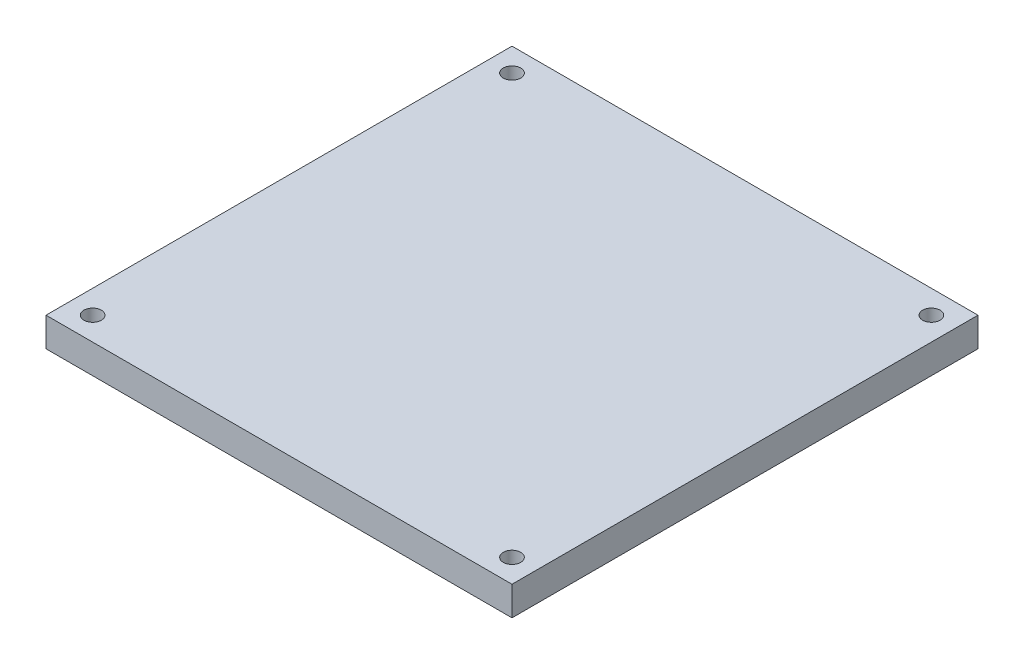
ISO-10303-21;
HEADER;
FILE_DESCRIPTION(('STEP AP214'),'2;1');
FILE_NAME('part.step','',(''),(''),'','','');
FILE_SCHEMA(('AUTOMOTIVE_DESIGN { 1 0 10303 214 1 1 1 1 }'));
ENDSEC;
DATA;
#1=APPLICATION_CONTEXT('core data for automotive mechanical design processes');
#2=APPLICATION_PROTOCOL_DEFINITION('international standard','automotive_design',2000,#1);
#3=PRODUCT_CONTEXT('',#1,'mechanical');
#4=PRODUCT('Part','Part','',(#3));
#5=PRODUCT_RELATED_PRODUCT_CATEGORY('part','',(#4));
#6=PRODUCT_DEFINITION_FORMATION('','',#4);
#7=PRODUCT_DEFINITION_CONTEXT('part definition',#1,'design');
#8=PRODUCT_DEFINITION('design','',#6,#7);
#9=PRODUCT_DEFINITION_SHAPE('','',#8);
#10=(LENGTH_UNIT() NAMED_UNIT(*) SI_UNIT(.MILLI.,.METRE.));
#11=(NAMED_UNIT(*) PLANE_ANGLE_UNIT() SI_UNIT($,.RADIAN.));
#12=(NAMED_UNIT(*) SI_UNIT($,.STERADIAN.) SOLID_ANGLE_UNIT());
#13=UNCERTAINTY_MEASURE_WITH_UNIT(LENGTH_MEASURE(1.E-05),#10,'distance_accuracy_value','');
#14=(GEOMETRIC_REPRESENTATION_CONTEXT(3) GLOBAL_UNCERTAINTY_ASSIGNED_CONTEXT((#13)) GLOBAL_UNIT_ASSIGNED_CONTEXT((#10,
#11,#12)) REPRESENTATION_CONTEXT('',''));
#15=CARTESIAN_POINT('',(0.,0.,0.));
#16=DIRECTION('',(0.,0.,1.));
#17=DIRECTION('',(1.,0.,0.));
#18=AXIS2_PLACEMENT_3D('',#15,#16,#17);
#19=CARTESIAN_POINT('',(-40.,5.,40.));
#20=DIRECTION('',(0.,1.,0.));
#21=DIRECTION('',(0.,0.,1.));
#22=AXIS2_PLACEMENT_3D('',#19,#20,#21);
#23=PLANE('',#22);
#24=CARTESIAN_POINT('',(-36.,5.,36.));
#25=DIRECTION('',(0.,1.,0.));
#26=DIRECTION('',(0.,0.,-1.));
#27=AXIS2_PLACEMENT_3D('',#24,#25,#26);
#28=CIRCLE('',#27,1.5);
#29=CARTESIAN_POINT('',(-36.,5.,34.5));
#30=VERTEX_POINT('',#29);
#31=EDGE_CURVE('E142',#30,#30,#28,.T.);
#32=ORIENTED_EDGE('',*,*,#31,.F.);
#33=EDGE_LOOP('',(#32));
#34=FACE_BOUND('',#33,.T.);
#35=CARTESIAN_POINT('',(-36.,5.,-36.));
#36=DIRECTION('',(0.,1.,0.));
#37=DIRECTION('',(0.,0.,1.));
#38=AXIS2_PLACEMENT_3D('',#35,#36,#37);
#39=CIRCLE('',#38,1.5);
#40=CARTESIAN_POINT('',(-36.,5.,-34.5));
#41=VERTEX_POINT('',#40);
#42=EDGE_CURVE('E112',#41,#41,#39,.T.);
#43=ORIENTED_EDGE('',*,*,#42,.F.);
#44=EDGE_LOOP('',(#43));
#45=FACE_BOUND('',#44,.T.);
#46=DIRECTION('',(0.,0.,1.));
#47=VECTOR('',#46,1.);
#48=CARTESIAN_POINT('',(-40.,5.,-40.));
#49=LINE('',#48,#47);
#50=CARTESIAN_POINT('',(-40.,5.,-40.));
#51=VERTEX_POINT('',#50);
#52=CARTESIAN_POINT('',(-40.,5.,40.));
#53=VERTEX_POINT('',#52);
#54=EDGE_CURVE('E92',#51,#53,#49,.T.);
#55=ORIENTED_EDGE('',*,*,#54,.T.);
#56=DIRECTION('',(1.,0.,0.));
#57=VECTOR('',#56,1.);
#58=CARTESIAN_POINT('',(-40.,5.,40.));
#59=LINE('',#58,#57);
#60=CARTESIAN_POINT('',(40.,5.,40.));
#61=VERTEX_POINT('',#60);
#62=EDGE_CURVE('E87',#53,#61,#59,.T.);
#63=ORIENTED_EDGE('',*,*,#62,.T.);
#64=DIRECTION('',(0.,0.,-1.));
#65=VECTOR('',#64,1.);
#66=CARTESIAN_POINT('',(40.,5.,-40.));
#67=LINE('',#66,#65);
#68=CARTESIAN_POINT('',(40.,5.,-40.));
#69=VERTEX_POINT('',#68);
#70=EDGE_CURVE('E90',#61,#69,#67,.T.);
#71=ORIENTED_EDGE('',*,*,#70,.T.);
#72=DIRECTION('',(-1.,0.,0.));
#73=VECTOR('',#72,1.);
#74=CARTESIAN_POINT('',(-40.,5.,-40.));
#75=LINE('',#74,#73);
#76=EDGE_CURVE('E57',#69,#51,#75,.T.);
#77=ORIENTED_EDGE('',*,*,#76,.T.);
#78=EDGE_LOOP('',(#55,#63,#71,#77));
#79=FACE_BOUND('',#78,.T.);
#80=CARTESIAN_POINT('',(36.,5.,-36.));
#81=DIRECTION('',(0.,1.,0.));
#82=DIRECTION('',(0.,0.,-1.));
#83=AXIS2_PLACEMENT_3D('',#80,#81,#82);
#84=CIRCLE('',#83,1.5);
#85=CARTESIAN_POINT('',(36.,5.,-37.5));
#86=VERTEX_POINT('',#85);
#87=EDGE_CURVE('E134',#86,#86,#84,.T.);
#88=ORIENTED_EDGE('',*,*,#87,.F.);
#89=EDGE_LOOP('',(#88));
#90=FACE_BOUND('',#89,.T.);
#91=CARTESIAN_POINT('',(36.,5.,36.));
#92=DIRECTION('',(0.,1.,0.));
#93=DIRECTION('',(0.,0.,1.));
#94=AXIS2_PLACEMENT_3D('',#91,#92,#93);
#95=CIRCLE('',#94,1.5);
#96=CARTESIAN_POINT('',(36.,5.,37.5));
#97=VERTEX_POINT('',#96);
#98=EDGE_CURVE('E150',#97,#97,#95,.T.);
#99=ORIENTED_EDGE('',*,*,#98,.F.);
#100=EDGE_LOOP('',(#99));
#101=FACE_BOUND('',#100,.T.);
#102=ADVANCED_FACE('F39',(#34,#45,#79,#90,#101),#23,.T.);
#103=CARTESIAN_POINT('',(-40.,0.,40.));
#104=DIRECTION('',(0.,1.,0.));
#105=DIRECTION('',(0.,0.,1.));
#106=AXIS2_PLACEMENT_3D('',#103,#104,#105);
#107=PLANE('',#106);
#108=CARTESIAN_POINT('',(-36.,0.,36.));
#109=DIRECTION('',(0.,1.,0.));
#110=DIRECTION('',(0.,0.,-1.));
#111=AXIS2_PLACEMENT_3D('',#108,#109,#110);
#112=CIRCLE('',#111,1.5);
#113=CARTESIAN_POINT('',(-36.,0.,34.5));
#114=VERTEX_POINT('',#113);
#115=EDGE_CURVE('E146',#114,#114,#112,.T.);
#116=ORIENTED_EDGE('',*,*,#115,.T.);
#117=EDGE_LOOP('',(#116));
#118=FACE_BOUND('',#117,.T.);
#119=CARTESIAN_POINT('',(-36.,0.,-36.));
#120=DIRECTION('',(0.,1.,0.));
#121=DIRECTION('',(0.,0.,1.));
#122=AXIS2_PLACEMENT_3D('',#119,#120,#121);
#123=CIRCLE('',#122,1.5);
#124=CARTESIAN_POINT('',(-36.,0.,-34.5));
#125=VERTEX_POINT('',#124);
#126=EDGE_CURVE('E130',#125,#125,#123,.T.);
#127=ORIENTED_EDGE('',*,*,#126,.T.);
#128=EDGE_LOOP('',(#127));
#129=FACE_BOUND('',#128,.T.);
#130=DIRECTION('',(0.,0.,1.));
#131=VECTOR('',#130,1.);
#132=CARTESIAN_POINT('',(-40.,0.,-40.));
#133=LINE('',#132,#131);
#134=CARTESIAN_POINT('',(-40.,0.,-40.));
#135=VERTEX_POINT('',#134);
#136=CARTESIAN_POINT('',(-40.,0.,40.));
#137=VERTEX_POINT('',#136);
#138=EDGE_CURVE('E108',#135,#137,#133,.T.);
#139=ORIENTED_EDGE('',*,*,#138,.F.);
#140=DIRECTION('',(-1.,0.,0.));
#141=VECTOR('',#140,1.);
#142=CARTESIAN_POINT('',(-40.,0.,-40.));
#143=LINE('',#142,#141);
#144=CARTESIAN_POINT('',(40.,0.,-40.));
#145=VERTEX_POINT('',#144);
#146=EDGE_CURVE('E80',#145,#135,#143,.T.);
#147=ORIENTED_EDGE('',*,*,#146,.F.);
#148=DIRECTION('',(0.,0.,-1.));
#149=VECTOR('',#148,1.);
#150=CARTESIAN_POINT('',(40.,0.,-40.));
#151=LINE('',#150,#149);
#152=CARTESIAN_POINT('',(40.,0.,40.));
#153=VERTEX_POINT('',#152);
#154=EDGE_CURVE('E74',#153,#145,#151,.T.);
#155=ORIENTED_EDGE('',*,*,#154,.F.);
#156=DIRECTION('',(1.,0.,0.));
#157=VECTOR('',#156,1.);
#158=CARTESIAN_POINT('',(-40.,0.,40.));
#159=LINE('',#158,#157);
#160=EDGE_CURVE('E97',#137,#153,#159,.T.);
#161=ORIENTED_EDGE('',*,*,#160,.F.);
#162=EDGE_LOOP('',(#139,#147,#155,#161));
#163=FACE_BOUND('',#162,.T.);
#164=CARTESIAN_POINT('',(36.,0.,-36.));
#165=DIRECTION('',(0.,1.,0.));
#166=DIRECTION('',(0.,0.,-1.));
#167=AXIS2_PLACEMENT_3D('',#164,#165,#166);
#168=CIRCLE('',#167,1.5);
#169=CARTESIAN_POINT('',(36.,0.,-37.5));
#170=VERTEX_POINT('',#169);
#171=EDGE_CURVE('E138',#170,#170,#168,.T.);
#172=ORIENTED_EDGE('',*,*,#171,.T.);
#173=EDGE_LOOP('',(#172));
#174=FACE_BOUND('',#173,.T.);
#175=CARTESIAN_POINT('',(36.,0.,36.));
#176=DIRECTION('',(0.,1.,0.));
#177=DIRECTION('',(0.,0.,1.));
#178=AXIS2_PLACEMENT_3D('',#175,#176,#177);
#179=CIRCLE('',#178,1.5);
#180=CARTESIAN_POINT('',(36.,0.,37.5));
#181=VERTEX_POINT('',#180);
#182=EDGE_CURVE('E154',#181,#181,#179,.T.);
#183=ORIENTED_EDGE('',*,*,#182,.T.);
#184=EDGE_LOOP('',(#183));
#185=FACE_BOUND('',#184,.T.);
#186=ADVANCED_FACE('F125',(#118,#129,#163,#174,#185),#107,.F.);
#187=CARTESIAN_POINT('',(-40.,5.,-40.));
#188=DIRECTION('',(1.,0.,0.));
#189=DIRECTION('',(0.,0.,-1.));
#190=AXIS2_PLACEMENT_3D('',#187,#188,#189);
#191=PLANE('',#190);
#192=ORIENTED_EDGE('',*,*,#138,.T.);
#193=DIRECTION('',(0.,-1.,0.));
#194=VECTOR('',#193,1.);
#195=CARTESIAN_POINT('',(-40.,5.,40.));
#196=LINE('',#195,#194);
#197=EDGE_CURVE('E11',#53,#137,#196,.T.);
#198=ORIENTED_EDGE('',*,*,#197,.F.);
#199=ORIENTED_EDGE('',*,*,#54,.F.);
#200=DIRECTION('',(0.,-1.,0.));
#201=VECTOR('',#200,1.);
#202=CARTESIAN_POINT('',(-40.,5.,-40.));
#203=LINE('',#202,#201);
#204=EDGE_CURVE('E104',#51,#135,#203,.T.);
#205=ORIENTED_EDGE('',*,*,#204,.T.);
#206=EDGE_LOOP('',(#192,#198,#199,#205));
#207=FACE_BOUND('',#206,.T.);
#208=ADVANCED_FACE('F41',(#207),#191,.F.);
#209=CARTESIAN_POINT('',(-40.,5.,40.));
#210=DIRECTION('',(0.,0.,-1.));
#211=DIRECTION('',(-1.,0.,0.));
#212=AXIS2_PLACEMENT_3D('',#209,#210,#211);
#213=PLANE('',#212);
#214=ORIENTED_EDGE('',*,*,#160,.T.);
#215=DIRECTION('',(0.,-1.,0.));
#216=VECTOR('',#215,1.);
#217=CARTESIAN_POINT('',(40.,5.,40.));
#218=LINE('',#217,#216);
#219=EDGE_CURVE('E49',#61,#153,#218,.T.);
#220=ORIENTED_EDGE('',*,*,#219,.F.);
#221=ORIENTED_EDGE('',*,*,#62,.F.);
#222=ORIENTED_EDGE('',*,*,#197,.T.);
#223=EDGE_LOOP('',(#214,#220,#221,#222));
#224=FACE_BOUND('',#223,.T.);
#225=ADVANCED_FACE('F96',(#224),#213,.F.);
#226=CARTESIAN_POINT('',(40.,5.,-40.));
#227=DIRECTION('',(-1.,0.,0.));
#228=DIRECTION('',(0.,0.,1.));
#229=AXIS2_PLACEMENT_3D('',#226,#227,#228);
#230=PLANE('',#229);
#231=ORIENTED_EDGE('',*,*,#154,.T.);
#232=DIRECTION('',(0.,-1.,0.));
#233=VECTOR('',#232,1.);
#234=CARTESIAN_POINT('',(40.,5.,-40.));
#235=LINE('',#234,#233);
#236=EDGE_CURVE('E99',#69,#145,#235,.T.);
#237=ORIENTED_EDGE('',*,*,#236,.F.);
#238=ORIENTED_EDGE('',*,*,#70,.F.);
#239=ORIENTED_EDGE('',*,*,#219,.T.);
#240=EDGE_LOOP('',(#231,#237,#238,#239));
#241=FACE_BOUND('',#240,.T.);
#242=ADVANCED_FACE('F100',(#241),#230,.F.);
#243=CARTESIAN_POINT('',(-40.,5.,-40.));
#244=DIRECTION('',(0.,0.,1.));
#245=DIRECTION('',(1.,0.,0.));
#246=AXIS2_PLACEMENT_3D('',#243,#244,#245);
#247=PLANE('',#246);
#248=ORIENTED_EDGE('',*,*,#146,.T.);
#249=ORIENTED_EDGE('',*,*,#204,.F.);
#250=ORIENTED_EDGE('',*,*,#76,.F.);
#251=ORIENTED_EDGE('',*,*,#236,.T.);
#252=EDGE_LOOP('',(#248,#249,#250,#251));
#253=FACE_BOUND('',#252,.T.);
#254=ADVANCED_FACE('F122',(#253),#247,.F.);
#255=CARTESIAN_POINT('',(-36.,5.,-36.));
#256=DIRECTION('',(0.,-1.,0.));
#257=DIRECTION('',(0.,0.,-1.));
#258=AXIS2_PLACEMENT_3D('',#255,#256,#257);
#259=CYLINDRICAL_SURFACE('',#258,1.5);
#260=ORIENTED_EDGE('',*,*,#42,.T.);
#261=EDGE_LOOP('',(#260));
#262=FACE_BOUND('',#261,.T.);
#263=ORIENTED_EDGE('',*,*,#126,.F.);
#264=EDGE_LOOP('',(#263));
#265=FACE_BOUND('',#264,.T.);
#266=ADVANCED_FACE('F176',(#262,#265),#259,.F.);
#267=CARTESIAN_POINT('',(36.,5.,-36.));
#268=DIRECTION('',(0.,-1.,0.));
#269=DIRECTION('',(0.,0.,-1.));
#270=AXIS2_PLACEMENT_3D('',#267,#268,#269);
#271=CYLINDRICAL_SURFACE('',#270,1.5);
#272=ORIENTED_EDGE('',*,*,#87,.T.);
#273=EDGE_LOOP('',(#272));
#274=FACE_BOUND('',#273,.T.);
#275=ORIENTED_EDGE('',*,*,#171,.F.);
#276=EDGE_LOOP('',(#275));
#277=FACE_BOUND('',#276,.T.);
#278=ADVANCED_FACE('F222',(#274,#277),#271,.F.);
#279=CARTESIAN_POINT('',(-36.,5.,36.));
#280=DIRECTION('',(0.,-1.,0.));
#281=DIRECTION('',(0.,0.,-1.));
#282=AXIS2_PLACEMENT_3D('',#279,#280,#281);
#283=CYLINDRICAL_SURFACE('',#282,1.5);
#284=ORIENTED_EDGE('',*,*,#31,.T.);
#285=EDGE_LOOP('',(#284));
#286=FACE_BOUND('',#285,.T.);
#287=ORIENTED_EDGE('',*,*,#115,.F.);
#288=EDGE_LOOP('',(#287));
#289=FACE_BOUND('',#288,.T.);
#290=ADVANCED_FACE('F230',(#286,#289),#283,.F.);
#291=CARTESIAN_POINT('',(36.,5.,36.));
#292=DIRECTION('',(0.,-1.,0.));
#293=DIRECTION('',(0.,0.,-1.));
#294=AXIS2_PLACEMENT_3D('',#291,#292,#293);
#295=CYLINDRICAL_SURFACE('',#294,1.5);
#296=ORIENTED_EDGE('',*,*,#98,.T.);
#297=EDGE_LOOP('',(#296));
#298=FACE_BOUND('',#297,.T.);
#299=ORIENTED_EDGE('',*,*,#182,.F.);
#300=EDGE_LOOP('',(#299));
#301=FACE_BOUND('',#300,.T.);
#302=ADVANCED_FACE('F162',(#298,#301),#295,.F.);
#303=CLOSED_SHELL('',(#102,#186,#208,#225,#242,#254,#266,#278,#290,#302));
#304=MANIFOLD_SOLID_BREP('B2',#303);
#305=ADVANCED_BREP_SHAPE_REPRESENTATION('',(#18,#304),#14);
#306=SHAPE_DEFINITION_REPRESENTATION(#9,#305);
ENDSEC;
END-ISO-10303-21;
